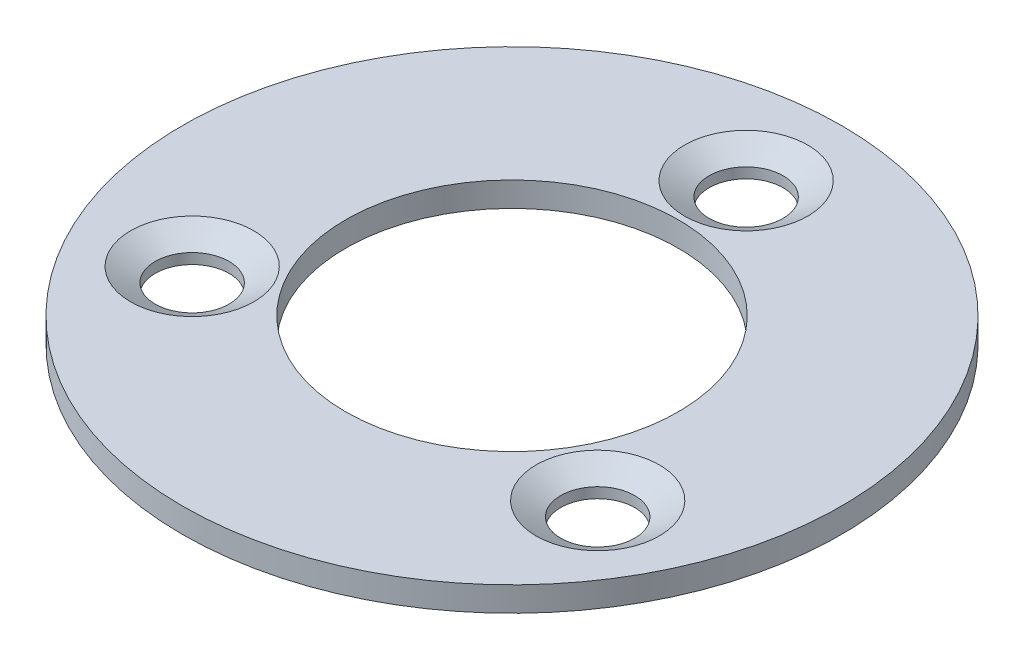
ISO-10303-21;
HEADER;
FILE_DESCRIPTION(('STEP AP214'),'2;1');
FILE_NAME('part.step','',(''),(''),'','','');
FILE_SCHEMA(('AUTOMOTIVE_DESIGN { 1 0 10303 214 1 1 1 1 }'));
ENDSEC;
DATA;
#1=APPLICATION_CONTEXT('core data for automotive mechanical design processes');
#2=APPLICATION_PROTOCOL_DEFINITION('international standard','automotive_design',2000,#1);
#3=PRODUCT_CONTEXT('',#1,'mechanical');
#4=PRODUCT('Part','Part','',(#3));
#5=PRODUCT_RELATED_PRODUCT_CATEGORY('part','',(#4));
#6=PRODUCT_DEFINITION_FORMATION('','',#4);
#7=PRODUCT_DEFINITION_CONTEXT('part definition',#1,'design');
#8=PRODUCT_DEFINITION('design','',#6,#7);
#9=PRODUCT_DEFINITION_SHAPE('','',#8);
#10=(LENGTH_UNIT() NAMED_UNIT(*) SI_UNIT(.MILLI.,.METRE.));
#11=(NAMED_UNIT(*) PLANE_ANGLE_UNIT() SI_UNIT($,.RADIAN.));
#12=(NAMED_UNIT(*) SI_UNIT($,.STERADIAN.) SOLID_ANGLE_UNIT());
#13=UNCERTAINTY_MEASURE_WITH_UNIT(LENGTH_MEASURE(1.E-05),#10,'distance_accuracy_value','');
#14=(GEOMETRIC_REPRESENTATION_CONTEXT(3) GLOBAL_UNCERTAINTY_ASSIGNED_CONTEXT((#13)) GLOBAL_UNIT_ASSIGNED_CONTEXT((#10,
#11,#12)) REPRESENTATION_CONTEXT('',''));
#15=CARTESIAN_POINT('',(0.,0.,0.));
#16=DIRECTION('',(0.,0.,1.));
#17=DIRECTION('',(1.,0.,0.));
#18=AXIS2_PLACEMENT_3D('',#15,#16,#17);
#19=CARTESIAN_POINT('',(0.,1.,0.));
#20=DIRECTION('',(0.,1.,0.));
#21=DIRECTION('',(0.,0.,1.));
#22=AXIS2_PLACEMENT_3D('',#19,#20,#21);
#23=PLANE('',#22);
#24=CARTESIAN_POINT('',(8.22724133595277,1.,4.74999999999965));
#25=DIRECTION('',(0.,1.,0.));
#26=DIRECTION('',(0.,0.,1.));
#27=AXIS2_PLACEMENT_3D('',#24,#25,#26);
#28=CIRCLE('',#27,2.50000000000053);
#29=CARTESIAN_POINT('',(8.22724133595277,1.,7.25000000000018));
#30=VERTEX_POINT('',#29);
#31=EDGE_CURVE('E53',#30,#30,#28,.F.);
#32=ORIENTED_EDGE('',*,*,#31,.T.);
#33=EDGE_LOOP('',(#32));
#34=FACE_BOUND('',#33,.T.);
#35=CARTESIAN_POINT('',(-8.22724133595156,1.,4.75000000000035));
#36=DIRECTION('',(0.,1.,0.));
#37=DIRECTION('',(0.,0.,1.));
#38=AXIS2_PLACEMENT_3D('',#35,#36,#37);
#39=CIRCLE('',#38,2.50000000000077);
#40=CARTESIAN_POINT('',(-8.22724133595156,1.,7.25000000000112));
#41=VERTEX_POINT('',#40);
#42=EDGE_CURVE('E58',#41,#41,#39,.F.);
#43=ORIENTED_EDGE('',*,*,#42,.T.);
#44=EDGE_LOOP('',(#43));
#45=FACE_BOUND('',#44,.T.);
#46=CARTESIAN_POINT('',(0.,1.,-9.5));
#47=DIRECTION('',(0.,1.,0.));
#48=DIRECTION('',(0.,0.,1.));
#49=AXIS2_PLACEMENT_3D('',#46,#47,#48);
#50=CIRCLE('',#49,2.50000000000002);
#51=CARTESIAN_POINT('',(0.,1.,-6.99999999999998));
#52=VERTEX_POINT('',#51);
#53=EDGE_CURVE('E64',#52,#52,#50,.F.);
#54=ORIENTED_EDGE('',*,*,#53,.T.);
#55=EDGE_LOOP('',(#54));
#56=FACE_BOUND('',#55,.T.);
#57=CARTESIAN_POINT('',(0.,1.,0.));
#58=DIRECTION('',(0.,1.,0.));
#59=DIRECTION('',(0.,0.,1.));
#60=AXIS2_PLACEMENT_3D('',#57,#58,#59);
#61=CIRCLE('',#60,13.3717532284914);
#62=CARTESIAN_POINT('',(0.,1.,13.3717532284914));
#63=VERTEX_POINT('',#62);
#64=EDGE_CURVE('E72',#63,#63,#61,.T.);
#65=ORIENTED_EDGE('',*,*,#64,.T.);
#66=EDGE_LOOP('',(#65));
#67=FACE_BOUND('',#66,.T.);
#68=CARTESIAN_POINT('',(0.,1.,0.));
#69=DIRECTION('',(0.,1.,0.));
#70=DIRECTION('',(0.,0.,1.));
#71=AXIS2_PLACEMENT_3D('',#68,#69,#70);
#72=CIRCLE('',#71,6.75);
#73=CARTESIAN_POINT('',(0.,1.,6.75));
#74=VERTEX_POINT('',#73);
#75=EDGE_CURVE('E90',#74,#74,#72,.T.);
#76=ORIENTED_EDGE('',*,*,#75,.F.);
#77=EDGE_LOOP('',(#76));
#78=FACE_BOUND('',#77,.T.);
#79=ADVANCED_FACE('F39',(#34,#45,#56,#67,#78),#23,.T.);
#80=CARTESIAN_POINT('',(0.,0.,0.));
#81=DIRECTION('',(0.,1.,0.));
#82=DIRECTION('',(0.,0.,1.));
#83=AXIS2_PLACEMENT_3D('',#80,#81,#82);
#84=PLANE('',#83);
#85=CARTESIAN_POINT('',(0.,0.,-9.5));
#86=DIRECTION('',(0.,1.,0.));
#87=DIRECTION('',(0.,0.,1.));
#88=AXIS2_PLACEMENT_3D('',#85,#86,#87);
#89=CIRCLE('',#88,1.5);
#90=CARTESIAN_POINT('',(0.,0.,-8.));
#91=VERTEX_POINT('',#90);
#92=EDGE_CURVE('E73',#91,#91,#89,.T.);
#93=ORIENTED_EDGE('',*,*,#92,.T.);
#94=EDGE_LOOP('',(#93));
#95=FACE_BOUND('',#94,.T.);
#96=CARTESIAN_POINT('',(8.22724133595277,0.,4.74999999999965));
#97=DIRECTION('',(0.,1.,0.));
#98=DIRECTION('',(0.,0.,1.));
#99=AXIS2_PLACEMENT_3D('',#96,#97,#98);
#100=CIRCLE('',#99,1.50000000000052);
#101=CARTESIAN_POINT('',(8.22724133595277,0.,6.25000000000017));
#102=VERTEX_POINT('',#101);
#103=EDGE_CURVE('E78',#102,#102,#100,.T.);
#104=ORIENTED_EDGE('',*,*,#103,.T.);
#105=EDGE_LOOP('',(#104));
#106=FACE_BOUND('',#105,.T.);
#107=CARTESIAN_POINT('',(-8.22724133595156,0.,4.75000000000035));
#108=DIRECTION('',(0.,1.,0.));
#109=DIRECTION('',(0.,0.,1.));
#110=AXIS2_PLACEMENT_3D('',#107,#108,#109);
#111=CIRCLE('',#110,1.50000000000077);
#112=CARTESIAN_POINT('',(-8.22724133595156,0.,6.25000000000112));
#113=VERTEX_POINT('',#112);
#114=EDGE_CURVE('E82',#113,#113,#111,.T.);
#115=ORIENTED_EDGE('',*,*,#114,.T.);
#116=EDGE_LOOP('',(#115));
#117=FACE_BOUND('',#116,.T.);
#118=CARTESIAN_POINT('',(0.,0.,0.));
#119=DIRECTION('',(0.,1.,0.));
#120=DIRECTION('',(0.,0.,1.));
#121=AXIS2_PLACEMENT_3D('',#118,#119,#120);
#122=CIRCLE('',#121,13.3717532284914);
#123=CARTESIAN_POINT('',(0.,0.,13.3717532284914));
#124=VERTEX_POINT('',#123);
#125=EDGE_CURVE('E86',#124,#124,#122,.T.);
#126=ORIENTED_EDGE('',*,*,#125,.F.);
#127=EDGE_LOOP('',(#126));
#128=FACE_BOUND('',#127,.T.);
#129=CARTESIAN_POINT('',(0.,0.,0.));
#130=DIRECTION('',(0.,1.,0.));
#131=DIRECTION('',(0.,0.,1.));
#132=AXIS2_PLACEMENT_3D('',#129,#130,#131);
#133=CIRCLE('',#132,6.75);
#134=CARTESIAN_POINT('',(0.,0.,6.75));
#135=VERTEX_POINT('',#134);
#136=EDGE_CURVE('E77',#135,#135,#133,.T.);
#137=ORIENTED_EDGE('',*,*,#136,.T.);
#138=EDGE_LOOP('',(#137));
#139=FACE_BOUND('',#138,.T.);
#140=ADVANCED_FACE('F105',(#95,#106,#117,#128,#139),#84,.F.);
#141=CARTESIAN_POINT('',(0.,1.,0.));
#142=DIRECTION('',(0.,-1.,0.));
#143=DIRECTION('',(0.,0.,-1.));
#144=AXIS2_PLACEMENT_3D('',#141,#142,#143);
#145=CYLINDRICAL_SURFACE('',#144,13.3717532284914);
#146=ORIENTED_EDGE('',*,*,#64,.F.);
#147=EDGE_LOOP('',(#146));
#148=FACE_BOUND('',#147,.T.);
#149=ORIENTED_EDGE('',*,*,#125,.T.);
#150=EDGE_LOOP('',(#149));
#151=FACE_BOUND('',#150,.T.);
#152=ADVANCED_FACE('F111',(#148,#151),#145,.T.);
#153=CARTESIAN_POINT('',(0.,1.,0.));
#154=DIRECTION('',(0.,-1.,0.));
#155=DIRECTION('',(0.,0.,-1.));
#156=AXIS2_PLACEMENT_3D('',#153,#154,#155);
#157=CYLINDRICAL_SURFACE('',#156,6.75);
#158=ORIENTED_EDGE('',*,*,#75,.T.);
#159=EDGE_LOOP('',(#158));
#160=FACE_BOUND('',#159,.T.);
#161=ORIENTED_EDGE('',*,*,#136,.F.);
#162=EDGE_LOOP('',(#161));
#163=FACE_BOUND('',#162,.T.);
#164=ADVANCED_FACE('F101',(#160,#163),#157,.F.);
#165=CARTESIAN_POINT('',(-8.22724133595156,-1.,4.75000000000035));
#166=DIRECTION('',(0.,1.,0.));
#167=DIRECTION('',(0.,0.,1.));
#168=AXIS2_PLACEMENT_3D('',#165,#166,#167);
#169=CYLINDRICAL_SURFACE('',#168,1.50000000000077);
#170=CARTESIAN_POINT('',(-8.22724133595156,0.422649730810374,4.75000000000035));
#171=DIRECTION('',(0.,1.,0.));
#172=DIRECTION('',(0.,0.,1.));
#173=AXIS2_PLACEMENT_3D('',#170,#171,#172);
#174=CIRCLE('',#173,1.50000000000077);
#175=CARTESIAN_POINT('',(-8.22724133595156,0.422649730810374,6.25000000000112));
#176=VERTEX_POINT('',#175);
#177=EDGE_CURVE('E48',#176,#176,#174,.T.);
#178=ORIENTED_EDGE('',*,*,#177,.T.);
#179=EDGE_LOOP('',(#178));
#180=FACE_BOUND('',#179,.T.);
#181=ORIENTED_EDGE('',*,*,#114,.F.);
#182=EDGE_LOOP('',(#181));
#183=FACE_BOUND('',#182,.T.);
#184=ADVANCED_FACE('F150',(#180,#183),#169,.F.);
#185=CARTESIAN_POINT('',(8.22724133595277,-1.,4.74999999999965));
#186=DIRECTION('',(0.,1.,0.));
#187=DIRECTION('',(0.,0.,1.));
#188=AXIS2_PLACEMENT_3D('',#185,#186,#187);
#189=CYLINDRICAL_SURFACE('',#188,1.50000000000052);
#190=CARTESIAN_POINT('',(8.22724133595277,0.422649730810371,4.74999999999965));
#191=DIRECTION('',(0.,1.,0.));
#192=DIRECTION('',(0.,0.,1.));
#193=AXIS2_PLACEMENT_3D('',#190,#191,#192);
#194=CIRCLE('',#193,1.50000000000052);
#195=CARTESIAN_POINT('',(8.22724133595277,0.422649730810371,6.25000000000017));
#196=VERTEX_POINT('',#195);
#197=EDGE_CURVE('E68',#196,#196,#194,.T.);
#198=ORIENTED_EDGE('',*,*,#197,.T.);
#199=EDGE_LOOP('',(#198));
#200=FACE_BOUND('',#199,.T.);
#201=ORIENTED_EDGE('',*,*,#103,.F.);
#202=EDGE_LOOP('',(#201));
#203=FACE_BOUND('',#202,.T.);
#204=ADVANCED_FACE('F154',(#200,#203),#189,.F.);
#205=CARTESIAN_POINT('',(0.,-1.,-9.5));
#206=DIRECTION('',(0.,1.,0.));
#207=DIRECTION('',(0.,0.,1.));
#208=AXIS2_PLACEMENT_3D('',#205,#206,#207);
#209=CYLINDRICAL_SURFACE('',#208,1.5);
#210=CARTESIAN_POINT('',(0.,0.422649730810369,-9.5));
#211=DIRECTION('',(0.,1.,0.));
#212=DIRECTION('',(0.,0.,1.));
#213=AXIS2_PLACEMENT_3D('',#210,#211,#212);
#214=CIRCLE('',#213,1.5);
#215=CARTESIAN_POINT('',(0.,0.422649730810369,-8.));
#216=VERTEX_POINT('',#215);
#217=EDGE_CURVE('E10',#216,#216,#214,.T.);
#218=ORIENTED_EDGE('',*,*,#217,.T.);
#219=EDGE_LOOP('',(#218));
#220=FACE_BOUND('',#219,.T.);
#221=ORIENTED_EDGE('',*,*,#92,.F.);
#222=EDGE_LOOP('',(#221));
#223=FACE_BOUND('',#222,.T.);
#224=ADVANCED_FACE('F128',(#220,#223),#209,.F.);
#225=CARTESIAN_POINT('',(8.22724133595277,0.422649730810371,4.74999999999965));
#226=DIRECTION('',(0.,1.,0.));
#227=DIRECTION('',(0.,0.,1.));
#228=AXIS2_PLACEMENT_3D('',#225,#226,#227);
#229=CONICAL_SURFACE('',#228,1.50000000000052,1.0471975511966);
#230=ORIENTED_EDGE('',*,*,#31,.F.);
#231=EDGE_LOOP('',(#230));
#232=FACE_BOUND('',#231,.T.);
#233=ORIENTED_EDGE('',*,*,#197,.F.);
#234=EDGE_LOOP('',(#233));
#235=FACE_BOUND('',#234,.T.);
#236=ADVANCED_FACE('F122',(#232,#235),#229,.F.);
#237=CARTESIAN_POINT('',(-8.22724133595156,0.422649730810374,4.75000000000035));
#238=DIRECTION('',(0.,1.,0.));
#239=DIRECTION('',(0.,0.,1.));
#240=AXIS2_PLACEMENT_3D('',#237,#238,#239);
#241=CONICAL_SURFACE('',#240,1.50000000000077,1.0471975511966);
#242=ORIENTED_EDGE('',*,*,#42,.F.);
#243=EDGE_LOOP('',(#242));
#244=FACE_BOUND('',#243,.T.);
#245=ORIENTED_EDGE('',*,*,#177,.F.);
#246=EDGE_LOOP('',(#245));
#247=FACE_BOUND('',#246,.T.);
#248=ADVANCED_FACE('F127',(#244,#247),#241,.F.);
#249=CARTESIAN_POINT('',(0.,0.422649730810369,-9.5));
#250=DIRECTION('',(0.,1.,0.));
#251=DIRECTION('',(0.,0.,1.));
#252=AXIS2_PLACEMENT_3D('',#249,#250,#251);
#253=CONICAL_SURFACE('',#252,1.5,1.0471975511966);
#254=ORIENTED_EDGE('',*,*,#53,.F.);
#255=EDGE_LOOP('',(#254));
#256=FACE_BOUND('',#255,.T.);
#257=ORIENTED_EDGE('',*,*,#217,.F.);
#258=EDGE_LOOP('',(#257));
#259=FACE_BOUND('',#258,.T.);
#260=ADVANCED_FACE('F42',(#256,#259),#253,.F.);
#261=CLOSED_SHELL('',(#79,#140,#152,#164,#184,#204,#224,#236,#248,#260));
#262=MANIFOLD_SOLID_BREP('B2',#261);
#263=ADVANCED_BREP_SHAPE_REPRESENTATION('',(#18,#262),#14);
#264=SHAPE_DEFINITION_REPRESENTATION(#9,#263);
ENDSEC;
END-ISO-10303-21;
